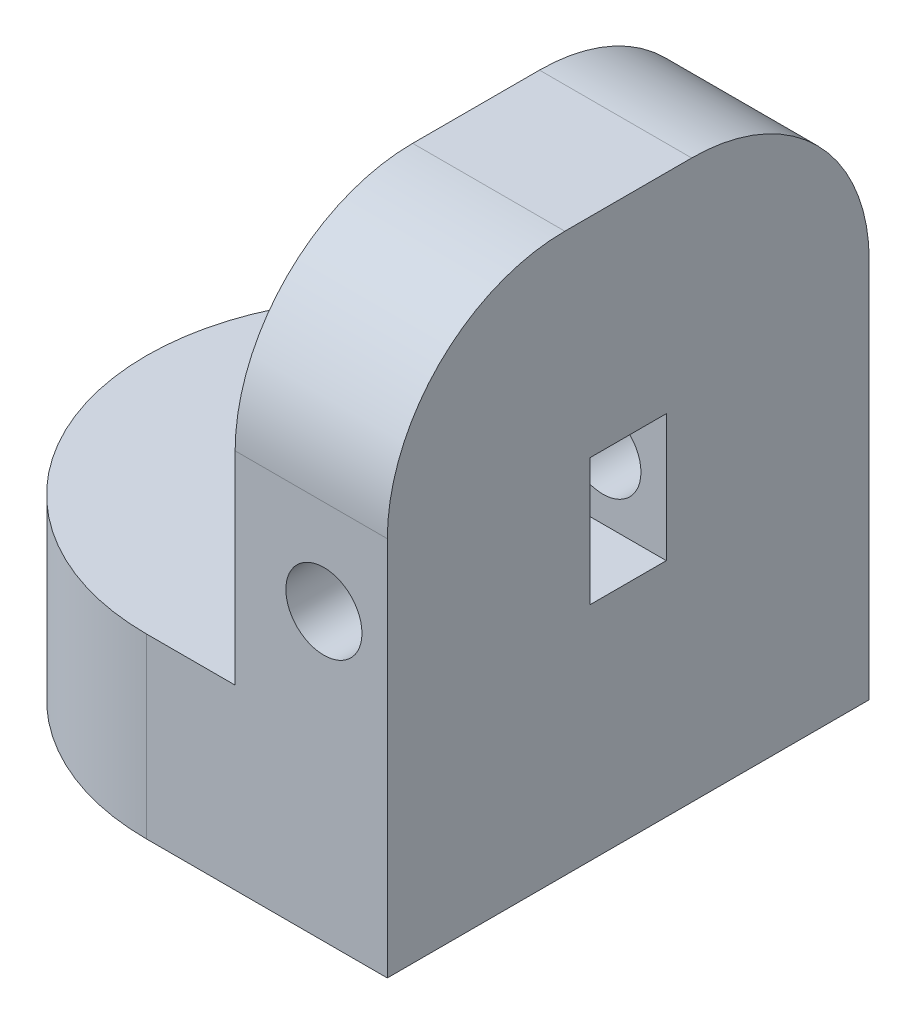
ISO-10303-21;
HEADER;
FILE_DESCRIPTION(('STEP AP214'),'2;1');
FILE_NAME('part.step','',(''),(''),'','','');
FILE_SCHEMA(('AUTOMOTIVE_DESIGN { 1 0 10303 214 1 1 1 1 }'));
ENDSEC;
DATA;
#1=APPLICATION_CONTEXT('core data for automotive mechanical design processes');
#2=APPLICATION_PROTOCOL_DEFINITION('international standard','automotive_design',2000,#1);
#3=PRODUCT_CONTEXT('',#1,'mechanical');
#4=PRODUCT('Part','Part','',(#3));
#5=PRODUCT_RELATED_PRODUCT_CATEGORY('part','',(#4));
#6=PRODUCT_DEFINITION_FORMATION('','',#4);
#7=PRODUCT_DEFINITION_CONTEXT('part definition',#1,'design');
#8=PRODUCT_DEFINITION('design','',#6,#7);
#9=PRODUCT_DEFINITION_SHAPE('','',#8);
#10=(LENGTH_UNIT() NAMED_UNIT(*) SI_UNIT(.MILLI.,.METRE.));
#11=(NAMED_UNIT(*) PLANE_ANGLE_UNIT() SI_UNIT($,.RADIAN.));
#12=(NAMED_UNIT(*) SI_UNIT($,.STERADIAN.) SOLID_ANGLE_UNIT());
#13=UNCERTAINTY_MEASURE_WITH_UNIT(LENGTH_MEASURE(1.E-05),#10,'distance_accuracy_value','');
#14=(GEOMETRIC_REPRESENTATION_CONTEXT(3) GLOBAL_UNCERTAINTY_ASSIGNED_CONTEXT((#13)) GLOBAL_UNIT_ASSIGNED_CONTEXT((#10,
#11,#12)) REPRESENTATION_CONTEXT('',''));
#15=CARTESIAN_POINT('',(0.,0.,0.));
#16=DIRECTION('',(0.,0.,1.));
#17=DIRECTION('',(1.,0.,0.));
#18=AXIS2_PLACEMENT_3D('',#15,#16,#17);
#19=CARTESIAN_POINT('',(9.5,7.,-9.5));
#20=DIRECTION('',(-1.,0.,0.));
#21=DIRECTION('',(0.,0.,1.));
#22=AXIS2_PLACEMENT_3D('',#19,#20,#21);
#23=PLANE('',#22);
#24=DIRECTION('',(0.,0.,-1.));
#25=VECTOR('',#24,1.);
#26=CARTESIAN_POINT('',(9.5,8.75,1.5));
#27=LINE('',#26,#25);
#28=CARTESIAN_POINT('',(9.5,8.75,1.5));
#29=VERTEX_POINT('',#28);
#30=CARTESIAN_POINT('',(9.5,8.75,-1.49999999999999));
#31=VERTEX_POINT('',#30);
#32=EDGE_CURVE('E145',#29,#31,#27,.T.);
#33=ORIENTED_EDGE('',*,*,#32,.F.);
#34=DIRECTION('',(0.,-1.,0.));
#35=VECTOR('',#34,1.);
#36=CARTESIAN_POINT('',(9.5,13.77,1.5));
#37=LINE('',#36,#35);
#38=CARTESIAN_POINT('',(9.5,13.77,1.5));
#39=VERTEX_POINT('',#38);
#40=EDGE_CURVE('E53',#39,#29,#37,.T.);
#41=ORIENTED_EDGE('',*,*,#40,.F.);
#42=DIRECTION('',(0.,0.,1.));
#43=VECTOR('',#42,1.);
#44=CARTESIAN_POINT('',(9.5,13.77,-1.49999999999999));
#45=LINE('',#44,#43);
#46=CARTESIAN_POINT('',(9.5,13.77,-1.49999999999999));
#47=VERTEX_POINT('',#46);
#48=EDGE_CURVE('E151',#47,#39,#45,.T.);
#49=ORIENTED_EDGE('',*,*,#48,.F.);
#50=DIRECTION('',(0.,1.,0.));
#51=VECTOR('',#50,1.);
#52=CARTESIAN_POINT('',(9.5,13.77,-1.49999999999999));
#53=LINE('',#52,#51);
#54=EDGE_CURVE('E136',#31,#47,#53,.T.);
#55=ORIENTED_EDGE('',*,*,#54,.F.);
#56=EDGE_LOOP('',(#33,#41,#49,#55));
#57=FACE_BOUND('',#56,.T.);
#58=DIRECTION('',(0.,-1.,0.));
#59=VECTOR('',#58,1.);
#60=CARTESIAN_POINT('',(9.5,7.,-9.5));
#61=LINE('',#60,#59);
#62=CARTESIAN_POINT('',(9.5,15.,-9.5));
#63=VERTEX_POINT('',#62);
#64=CARTESIAN_POINT('',(9.5,0.,-9.5));
#65=VERTEX_POINT('',#64);
#66=EDGE_CURVE('E190',#63,#65,#61,.T.);
#67=ORIENTED_EDGE('',*,*,#66,.F.);
#68=CARTESIAN_POINT('',(9.5,15.,-2.5));
#69=DIRECTION('',(-1.,0.,0.));
#70=DIRECTION('',(0.,0.,1.));
#71=AXIS2_PLACEMENT_3D('',#68,#69,#70);
#72=CIRCLE('',#71,7.);
#73=CARTESIAN_POINT('',(9.5,22.,-2.5));
#74=VERTEX_POINT('',#73);
#75=EDGE_CURVE('E221',#63,#74,#72,.F.);
#76=ORIENTED_EDGE('',*,*,#75,.T.);
#77=DIRECTION('',(0.,0.,-1.));
#78=VECTOR('',#77,1.);
#79=CARTESIAN_POINT('',(9.5,22.,-9.5));
#80=LINE('',#79,#78);
#81=CARTESIAN_POINT('',(9.5,22.,2.5));
#82=VERTEX_POINT('',#81);
#83=EDGE_CURVE('E161',#82,#74,#80,.T.);
#84=ORIENTED_EDGE('',*,*,#83,.F.);
#85=CARTESIAN_POINT('',(9.5,15.,2.5));
#86=DIRECTION('',(-1.,0.,0.));
#87=DIRECTION('',(0.,0.,1.));
#88=AXIS2_PLACEMENT_3D('',#85,#86,#87);
#89=CIRCLE('',#88,7.);
#90=CARTESIAN_POINT('',(9.5,15.,9.5));
#91=VERTEX_POINT('',#90);
#92=EDGE_CURVE('E219',#82,#91,#89,.F.);
#93=ORIENTED_EDGE('',*,*,#92,.T.);
#94=DIRECTION('',(0.,-1.,0.));
#95=VECTOR('',#94,1.);
#96=CARTESIAN_POINT('',(9.5,7.,9.5));
#97=LINE('',#96,#95);
#98=CARTESIAN_POINT('',(9.5,0.,9.5));
#99=VERTEX_POINT('',#98);
#100=EDGE_CURVE('E180',#91,#99,#97,.T.);
#101=ORIENTED_EDGE('',*,*,#100,.T.);
#102=DIRECTION('',(0.,0.,-1.));
#103=VECTOR('',#102,1.);
#104=CARTESIAN_POINT('',(9.5,0.,-9.5));
#105=LINE('',#104,#103);
#106=EDGE_CURVE('E181',#99,#65,#105,.T.);
#107=ORIENTED_EDGE('',*,*,#106,.T.);
#108=EDGE_LOOP('',(#67,#76,#84,#93,#101,#107));
#109=FACE_BOUND('',#108,.T.);
#110=ADVANCED_FACE('F37',(#57,#109),#23,.F.);
#111=CARTESIAN_POINT('',(-9.5,7.,-9.5));
#112=DIRECTION('',(0.,0.,1.));
#113=DIRECTION('',(1.,0.,0.));
#114=AXIS2_PLACEMENT_3D('',#111,#112,#113);
#115=PLANE('',#114);
#116=CARTESIAN_POINT('',(7.,11.27,-9.5));
#117=DIRECTION('',(0.,0.,1.));
#118=DIRECTION('',(1.,0.,0.));
#119=AXIS2_PLACEMENT_3D('',#116,#117,#118);
#120=CIRCLE('',#119,1.5);
#121=CARTESIAN_POINT('',(8.5,11.27,-9.5));
#122=VERTEX_POINT('',#121);
#123=EDGE_CURVE('E323',#122,#122,#120,.T.);
#124=ORIENTED_EDGE('',*,*,#123,.T.);
#125=EDGE_LOOP('',(#124));
#126=FACE_BOUND('',#125,.T.);
#127=DIRECTION('',(0.,-1.,0.));
#128=VECTOR('',#127,1.);
#129=CARTESIAN_POINT('',(3.5,22.,-9.5));
#130=LINE('',#129,#128);
#131=CARTESIAN_POINT('',(3.5,15.,-9.5));
#132=VERTEX_POINT('',#131);
#133=CARTESIAN_POINT('',(3.5,7.,-9.5));
#134=VERTEX_POINT('',#133);
#135=EDGE_CURVE('E171',#132,#134,#130,.T.);
#136=ORIENTED_EDGE('',*,*,#135,.F.);
#137=DIRECTION('',(-1.,0.,0.));
#138=VECTOR('',#137,1.);
#139=CARTESIAN_POINT('',(-9.5,15.,-9.5));
#140=LINE('',#139,#138);
#141=EDGE_CURVE('E217',#132,#63,#140,.F.);
#142=ORIENTED_EDGE('',*,*,#141,.T.);
#143=ORIENTED_EDGE('',*,*,#66,.T.);
#144=DIRECTION('',(-1.,0.,0.));
#145=VECTOR('',#144,1.);
#146=CARTESIAN_POINT('',(-9.5,0.,-9.5));
#147=LINE('',#146,#145);
#148=CARTESIAN_POINT('',(0.,0.,-9.5));
#149=VERTEX_POINT('',#148);
#150=EDGE_CURVE('E184',#65,#149,#147,.T.);
#151=ORIENTED_EDGE('',*,*,#150,.T.);
#152=DIRECTION('',(0.,-1.,0.));
#153=VECTOR('',#152,1.);
#154=CARTESIAN_POINT('',(0.,7.,-9.5));
#155=LINE('',#154,#153);
#156=CARTESIAN_POINT('',(0.,7.,-9.5));
#157=VERTEX_POINT('',#156);
#158=EDGE_CURVE('E196',#149,#157,#155,.F.);
#159=ORIENTED_EDGE('',*,*,#158,.T.);
#160=DIRECTION('',(-1.,0.,0.));
#161=VECTOR('',#160,1.);
#162=CARTESIAN_POINT('',(-9.5,7.,-9.5));
#163=LINE('',#162,#161);
#164=EDGE_CURVE('E174',#134,#157,#163,.T.);
#165=ORIENTED_EDGE('',*,*,#164,.F.);
#166=EDGE_LOOP('',(#136,#142,#143,#151,#159,#165));
#167=FACE_BOUND('',#166,.T.);
#168=ADVANCED_FACE('F250',(#126,#167),#115,.F.);
#169=CARTESIAN_POINT('',(-9.5,7.,9.5));
#170=DIRECTION('',(0.,0.,-1.));
#171=DIRECTION('',(-1.,0.,0.));
#172=AXIS2_PLACEMENT_3D('',#169,#170,#171);
#173=PLANE('',#172);
#174=CARTESIAN_POINT('',(7.,11.27,9.5));
#175=DIRECTION('',(0.,0.,1.));
#176=DIRECTION('',(1.,0.,0.));
#177=AXIS2_PLACEMENT_3D('',#174,#175,#176);
#178=CIRCLE('',#177,1.5);
#179=CARTESIAN_POINT('',(8.5,11.27,9.5));
#180=VERTEX_POINT('',#179);
#181=EDGE_CURVE('E321',#180,#180,#178,.T.);
#182=ORIENTED_EDGE('',*,*,#181,.F.);
#183=EDGE_LOOP('',(#182));
#184=FACE_BOUND('',#183,.T.);
#185=ORIENTED_EDGE('',*,*,#100,.F.);
#186=DIRECTION('',(1.,0.,0.));
#187=VECTOR('',#186,1.);
#188=CARTESIAN_POINT('',(-9.5,15.,9.5));
#189=LINE('',#188,#187);
#190=CARTESIAN_POINT('',(3.5,15.,9.5));
#191=VERTEX_POINT('',#190);
#192=EDGE_CURVE('E223',#91,#191,#189,.F.);
#193=ORIENTED_EDGE('',*,*,#192,.T.);
#194=DIRECTION('',(0.,-1.,0.));
#195=VECTOR('',#194,1.);
#196=CARTESIAN_POINT('',(3.5,22.,9.5));
#197=LINE('',#196,#195);
#198=CARTESIAN_POINT('',(3.5,7.,9.5));
#199=VERTEX_POINT('',#198);
#200=EDGE_CURVE('E167',#191,#199,#197,.T.);
#201=ORIENTED_EDGE('',*,*,#200,.T.);
#202=DIRECTION('',(1.,0.,0.));
#203=VECTOR('',#202,1.);
#204=CARTESIAN_POINT('',(-9.5,7.,9.5));
#205=LINE('',#204,#203);
#206=CARTESIAN_POINT('',(0.,7.,9.5));
#207=VERTEX_POINT('',#206);
#208=EDGE_CURVE('E176',#207,#199,#205,.T.);
#209=ORIENTED_EDGE('',*,*,#208,.F.);
#210=DIRECTION('',(0.,-1.,0.));
#211=VECTOR('',#210,1.);
#212=CARTESIAN_POINT('',(0.,7.,9.5));
#213=LINE('',#212,#211);
#214=CARTESIAN_POINT('',(0.,0.,9.5));
#215=VERTEX_POINT('',#214);
#216=EDGE_CURVE('E203',#207,#215,#213,.T.);
#217=ORIENTED_EDGE('',*,*,#216,.T.);
#218=DIRECTION('',(1.,0.,0.));
#219=VECTOR('',#218,1.);
#220=CARTESIAN_POINT('',(-9.5,0.,9.5));
#221=LINE('',#220,#219);
#222=EDGE_CURVE('E177',#215,#99,#221,.T.);
#223=ORIENTED_EDGE('',*,*,#222,.T.);
#224=EDGE_LOOP('',(#185,#193,#201,#209,#217,#223));
#225=FACE_BOUND('',#224,.T.);
#226=ADVANCED_FACE('F255',(#184,#225),#173,.F.);
#227=CARTESIAN_POINT('',(0.,7.,0.));
#228=DIRECTION('',(0.,1.,0.));
#229=DIRECTION('',(0.,0.,1.));
#230=AXIS2_PLACEMENT_3D('',#227,#228,#229);
#231=PLANE('',#230);
#232=CARTESIAN_POINT('',(-2.,7.,0.));
#233=DIRECTION('',(0.,1.,0.));
#234=DIRECTION('',(0.,0.,1.));
#235=AXIS2_PLACEMENT_3D('',#232,#233,#234);
#236=CIRCLE('',#235,2.);
#237=CARTESIAN_POINT('',(-2.,7.,2.));
#238=VERTEX_POINT('',#237);
#239=EDGE_CURVE('E329',#238,#238,#236,.T.);
#240=ORIENTED_EDGE('',*,*,#239,.F.);
#241=EDGE_LOOP('',(#240));
#242=FACE_BOUND('',#241,.T.);
#243=DIRECTION('',(0.,0.,1.));
#244=VECTOR('',#243,1.);
#245=CARTESIAN_POINT('',(3.5,7.,-9.5));
#246=LINE('',#245,#244);
#247=EDGE_CURVE('E158',#134,#199,#246,.T.);
#248=ORIENTED_EDGE('',*,*,#247,.F.);
#249=ORIENTED_EDGE('',*,*,#164,.T.);
#250=CARTESIAN_POINT('',(0.,7.,0.));
#251=DIRECTION('',(0.,1.,0.));
#252=DIRECTION('',(0.,0.,1.));
#253=AXIS2_PLACEMENT_3D('',#250,#251,#252);
#254=CIRCLE('',#253,9.5);
#255=CARTESIAN_POINT('',(-9.5,7.,0.));
#256=VERTEX_POINT('',#255);
#257=EDGE_CURVE('E201',#157,#256,#254,.T.);
#258=ORIENTED_EDGE('',*,*,#257,.T.);
#259=CARTESIAN_POINT('',(0.,7.,0.));
#260=DIRECTION('',(0.,1.,0.));
#261=DIRECTION('',(0.,0.,1.));
#262=AXIS2_PLACEMENT_3D('',#259,#260,#261);
#263=CIRCLE('',#262,9.5);
#264=EDGE_CURVE('E199',#256,#207,#263,.T.);
#265=ORIENTED_EDGE('',*,*,#264,.T.);
#266=ORIENTED_EDGE('',*,*,#208,.T.);
#267=EDGE_LOOP('',(#248,#249,#258,#265,#266));
#268=FACE_BOUND('',#267,.T.);
#269=ADVANCED_FACE('F304',(#242,#268),#231,.T.);
#270=CARTESIAN_POINT('',(0.,0.,0.));
#271=DIRECTION('',(0.,1.,0.));
#272=DIRECTION('',(0.,0.,1.));
#273=AXIS2_PLACEMENT_3D('',#270,#271,#272);
#274=PLANE('',#273);
#275=CARTESIAN_POINT('',(-2.,0.,0.));
#276=DIRECTION('',(0.,1.,0.));
#277=DIRECTION('',(0.,0.,1.));
#278=AXIS2_PLACEMENT_3D('',#275,#276,#277);
#279=CIRCLE('',#278,2.);
#280=CARTESIAN_POINT('',(-2.,0.,2.));
#281=VERTEX_POINT('',#280);
#282=EDGE_CURVE('E324',#281,#281,#279,.T.);
#283=ORIENTED_EDGE('',*,*,#282,.T.);
#284=EDGE_LOOP('',(#283));
#285=FACE_BOUND('',#284,.T.);
#286=CARTESIAN_POINT('',(0.,0.,0.));
#287=DIRECTION('',(0.,1.,0.));
#288=DIRECTION('',(0.,0.,1.));
#289=AXIS2_PLACEMENT_3D('',#286,#287,#288);
#290=CIRCLE('',#289,9.5);
#291=CARTESIAN_POINT('',(-9.5,0.,0.));
#292=VERTEX_POINT('',#291);
#293=EDGE_CURVE('E192',#215,#292,#290,.F.);
#294=ORIENTED_EDGE('',*,*,#293,.T.);
#295=CARTESIAN_POINT('',(0.,0.,0.));
#296=DIRECTION('',(0.,1.,0.));
#297=DIRECTION('',(0.,0.,1.));
#298=AXIS2_PLACEMENT_3D('',#295,#296,#297);
#299=CIRCLE('',#298,9.5);
#300=EDGE_CURVE('E194',#292,#149,#299,.F.);
#301=ORIENTED_EDGE('',*,*,#300,.T.);
#302=ORIENTED_EDGE('',*,*,#150,.F.);
#303=ORIENTED_EDGE('',*,*,#106,.F.);
#304=ORIENTED_EDGE('',*,*,#222,.F.);
#305=EDGE_LOOP('',(#294,#301,#302,#303,#304));
#306=FACE_BOUND('',#305,.T.);
#307=ADVANCED_FACE('F266',(#285,#306),#274,.F.);
#308=CARTESIAN_POINT('',(0.,7.,0.));
#309=DIRECTION('',(0.,-1.,0.));
#310=DIRECTION('',(0.,0.,-1.));
#311=AXIS2_PLACEMENT_3D('',#308,#309,#310);
#312=CYLINDRICAL_SURFACE('',#311,9.5);
#313=ORIENTED_EDGE('',*,*,#216,.F.);
#314=ORIENTED_EDGE('',*,*,#264,.F.);
#315=DIRECTION('',(0.,-1.,0.));
#316=VECTOR('',#315,1.);
#317=CARTESIAN_POINT('',(-9.5,7.,0.));
#318=LINE('',#317,#316);
#319=EDGE_CURVE('E173',#292,#256,#318,.F.);
#320=ORIENTED_EDGE('',*,*,#319,.F.);
#321=ORIENTED_EDGE('',*,*,#293,.F.);
#322=EDGE_LOOP('',(#313,#314,#320,#321));
#323=FACE_BOUND('',#322,.T.);
#324=ADVANCED_FACE('F263',(#323),#312,.T.);
#325=CARTESIAN_POINT('',(0.,7.,0.));
#326=DIRECTION('',(0.,-1.,0.));
#327=DIRECTION('',(0.,0.,-1.));
#328=AXIS2_PLACEMENT_3D('',#325,#326,#327);
#329=CYLINDRICAL_SURFACE('',#328,9.5);
#330=ORIENTED_EDGE('',*,*,#257,.F.);
#331=ORIENTED_EDGE('',*,*,#158,.F.);
#332=ORIENTED_EDGE('',*,*,#300,.F.);
#333=ORIENTED_EDGE('',*,*,#319,.T.);
#334=EDGE_LOOP('',(#330,#331,#332,#333));
#335=FACE_BOUND('',#334,.T.);
#336=ADVANCED_FACE('F260',(#335),#329,.T.);
#337=CARTESIAN_POINT('',(3.5,22.,-9.5));
#338=DIRECTION('',(1.,0.,0.));
#339=DIRECTION('',(0.,0.,-1.));
#340=AXIS2_PLACEMENT_3D('',#337,#338,#339);
#341=PLANE('',#340);
#342=DIRECTION('',(0.,0.,1.));
#343=VECTOR('',#342,1.);
#344=CARTESIAN_POINT('',(3.5,13.77,-9.5));
#345=LINE('',#344,#343);
#346=CARTESIAN_POINT('',(3.5,13.77,-1.49999999999999));
#347=VERTEX_POINT('',#346);
#348=CARTESIAN_POINT('',(3.5,13.77,1.5));
#349=VERTEX_POINT('',#348);
#350=EDGE_CURVE('E46',#347,#349,#345,.T.);
#351=ORIENTED_EDGE('',*,*,#350,.T.);
#352=DIRECTION('',(0.,-1.,0.));
#353=VECTOR('',#352,1.);
#354=CARTESIAN_POINT('',(3.5,22.,1.5));
#355=LINE('',#354,#353);
#356=CARTESIAN_POINT('',(3.5,8.75,1.5));
#357=VERTEX_POINT('',#356);
#358=EDGE_CURVE('E11',#349,#357,#355,.T.);
#359=ORIENTED_EDGE('',*,*,#358,.T.);
#360=DIRECTION('',(0.,0.,-1.));
#361=VECTOR('',#360,1.);
#362=CARTESIAN_POINT('',(3.5,8.75,-9.5));
#363=LINE('',#362,#361);
#364=CARTESIAN_POINT('',(3.5,8.75,-1.49999999999999));
#365=VERTEX_POINT('',#364);
#366=EDGE_CURVE('E225',#357,#365,#363,.T.);
#367=ORIENTED_EDGE('',*,*,#366,.T.);
#368=DIRECTION('',(0.,1.,0.));
#369=VECTOR('',#368,1.);
#370=CARTESIAN_POINT('',(3.5,22.,-1.49999999999999));
#371=LINE('',#370,#369);
#372=EDGE_CURVE('E139',#365,#347,#371,.T.);
#373=ORIENTED_EDGE('',*,*,#372,.T.);
#374=EDGE_LOOP('',(#351,#359,#367,#373));
#375=FACE_BOUND('',#374,.T.);
#376=DIRECTION('',(0.,0.,1.));
#377=VECTOR('',#376,1.);
#378=CARTESIAN_POINT('',(3.5,22.,-9.5));
#379=LINE('',#378,#377);
#380=CARTESIAN_POINT('',(3.5,22.,-2.5));
#381=VERTEX_POINT('',#380);
#382=CARTESIAN_POINT('',(3.5,22.,2.5));
#383=VERTEX_POINT('',#382);
#384=EDGE_CURVE('E164',#381,#383,#379,.T.);
#385=ORIENTED_EDGE('',*,*,#384,.F.);
#386=CARTESIAN_POINT('',(3.5,15.,-2.5));
#387=DIRECTION('',(1.,0.,0.));
#388=DIRECTION('',(0.,0.,-1.));
#389=AXIS2_PLACEMENT_3D('',#386,#387,#388);
#390=CIRCLE('',#389,7.);
#391=EDGE_CURVE('E215',#381,#132,#390,.F.);
#392=ORIENTED_EDGE('',*,*,#391,.T.);
#393=ORIENTED_EDGE('',*,*,#135,.T.);
#394=ORIENTED_EDGE('',*,*,#247,.T.);
#395=ORIENTED_EDGE('',*,*,#200,.F.);
#396=CARTESIAN_POINT('',(3.5,15.,2.5));
#397=DIRECTION('',(1.,0.,0.));
#398=DIRECTION('',(0.,0.,-1.));
#399=AXIS2_PLACEMENT_3D('',#396,#397,#398);
#400=CIRCLE('',#399,7.);
#401=EDGE_CURVE('E213',#191,#383,#400,.F.);
#402=ORIENTED_EDGE('',*,*,#401,.T.);
#403=EDGE_LOOP('',(#385,#392,#393,#394,#395,#402));
#404=FACE_BOUND('',#403,.T.);
#405=ADVANCED_FACE('F230',(#375,#404),#341,.F.);
#406=CARTESIAN_POINT('',(0.,22.,0.));
#407=DIRECTION('',(0.,-1.,0.));
#408=DIRECTION('',(0.,0.,-1.));
#409=AXIS2_PLACEMENT_3D('',#406,#407,#408);
#410=PLANE('',#409);
#411=ORIENTED_EDGE('',*,*,#83,.T.);
#412=DIRECTION('',(-1.,0.,0.));
#413=VECTOR('',#412,1.);
#414=CARTESIAN_POINT('',(0.,22.,-2.5));
#415=LINE('',#414,#413);
#416=EDGE_CURVE('E210',#74,#381,#415,.T.);
#417=ORIENTED_EDGE('',*,*,#416,.T.);
#418=ORIENTED_EDGE('',*,*,#384,.T.);
#419=DIRECTION('',(1.,0.,0.));
#420=VECTOR('',#419,1.);
#421=CARTESIAN_POINT('',(0.,22.,2.5));
#422=LINE('',#421,#420);
#423=EDGE_CURVE('E205',#383,#82,#422,.T.);
#424=ORIENTED_EDGE('',*,*,#423,.T.);
#425=EDGE_LOOP('',(#411,#417,#418,#424));
#426=FACE_BOUND('',#425,.T.);
#427=ADVANCED_FACE('F269',(#426),#410,.F.);
#428=CARTESIAN_POINT('',(0.,15.,-2.5));
#429=DIRECTION('',(-1.,0.,0.));
#430=DIRECTION('',(0.,0.,1.));
#431=AXIS2_PLACEMENT_3D('',#428,#429,#430);
#432=CYLINDRICAL_SURFACE('',#431,7.);
#433=ORIENTED_EDGE('',*,*,#75,.F.);
#434=ORIENTED_EDGE('',*,*,#141,.F.);
#435=ORIENTED_EDGE('',*,*,#391,.F.);
#436=ORIENTED_EDGE('',*,*,#416,.F.);
#437=EDGE_LOOP('',(#433,#434,#435,#436));
#438=FACE_BOUND('',#437,.T.);
#439=ADVANCED_FACE('F244',(#438),#432,.T.);
#440=CARTESIAN_POINT('',(0.,15.,2.5));
#441=DIRECTION('',(1.,0.,0.));
#442=DIRECTION('',(0.,0.,-1.));
#443=AXIS2_PLACEMENT_3D('',#440,#441,#442);
#444=CYLINDRICAL_SURFACE('',#443,7.);
#445=ORIENTED_EDGE('',*,*,#401,.F.);
#446=ORIENTED_EDGE('',*,*,#192,.F.);
#447=ORIENTED_EDGE('',*,*,#92,.F.);
#448=ORIENTED_EDGE('',*,*,#423,.F.);
#449=EDGE_LOOP('',(#445,#446,#447,#448));
#450=FACE_BOUND('',#449,.T.);
#451=ADVANCED_FACE('F39',(#450),#444,.T.);
#452=CARTESIAN_POINT('',(-9.5,13.77,1.5));
#453=DIRECTION('',(0.,0.,1.));
#454=DIRECTION('',(0.,-1.,0.));
#455=AXIS2_PLACEMENT_3D('',#452,#453,#454);
#456=PLANE('',#455);
#457=CARTESIAN_POINT('',(7.,11.27,1.5));
#458=DIRECTION('',(0.,0.,1.));
#459=DIRECTION('',(0.,-1.,0.));
#460=AXIS2_PLACEMENT_3D('',#457,#458,#459);
#461=CIRCLE('',#460,1.5);
#462=CARTESIAN_POINT('',(7.,9.77,1.5));
#463=VERTEX_POINT('',#462);
#464=EDGE_CURVE('E333',#463,#463,#461,.T.);
#465=ORIENTED_EDGE('',*,*,#464,.T.);
#466=EDGE_LOOP('',(#465));
#467=FACE_BOUND('',#466,.T.);
#468=DIRECTION('',(1.,0.,0.));
#469=VECTOR('',#468,1.);
#470=CARTESIAN_POINT('',(-9.5,13.77,1.5));
#471=LINE('',#470,#469);
#472=EDGE_CURVE('E156',#349,#39,#471,.T.);
#473=ORIENTED_EDGE('',*,*,#472,.T.);
#474=ORIENTED_EDGE('',*,*,#40,.T.);
#475=DIRECTION('',(1.,0.,0.));
#476=VECTOR('',#475,1.);
#477=CARTESIAN_POINT('',(-9.5,8.75,1.5));
#478=LINE('',#477,#476);
#479=EDGE_CURVE('E142',#357,#29,#478,.T.);
#480=ORIENTED_EDGE('',*,*,#479,.F.);
#481=ORIENTED_EDGE('',*,*,#358,.F.);
#482=EDGE_LOOP('',(#473,#474,#480,#481));
#483=FACE_BOUND('',#482,.T.);
#484=ADVANCED_FACE('F235',(#467,#483),#456,.F.);
#485=CARTESIAN_POINT('',(-9.5,13.77,-1.49999999999999));
#486=DIRECTION('',(0.,1.,0.));
#487=DIRECTION('',(0.,0.,1.));
#488=AXIS2_PLACEMENT_3D('',#485,#486,#487);
#489=PLANE('',#488);
#490=DIRECTION('',(1.,0.,0.));
#491=VECTOR('',#490,1.);
#492=CARTESIAN_POINT('',(-9.5,13.77,-1.49999999999999));
#493=LINE('',#492,#491);
#494=EDGE_CURVE('E141',#347,#47,#493,.T.);
#495=ORIENTED_EDGE('',*,*,#494,.T.);
#496=ORIENTED_EDGE('',*,*,#48,.T.);
#497=ORIENTED_EDGE('',*,*,#472,.F.);
#498=ORIENTED_EDGE('',*,*,#350,.F.);
#499=EDGE_LOOP('',(#495,#496,#497,#498));
#500=FACE_BOUND('',#499,.T.);
#501=ADVANCED_FACE('F234',(#500),#489,.F.);
#502=CARTESIAN_POINT('',(-9.5,13.77,-1.49999999999999));
#503=DIRECTION('',(0.,0.,-1.));
#504=DIRECTION('',(0.,1.,0.));
#505=AXIS2_PLACEMENT_3D('',#502,#503,#504);
#506=PLANE('',#505);
#507=CARTESIAN_POINT('',(7.,11.27,-1.49999999999999));
#508=DIRECTION('',(0.,0.,-1.));
#509=DIRECTION('',(0.,1.,0.));
#510=AXIS2_PLACEMENT_3D('',#507,#508,#509);
#511=CIRCLE('',#510,1.5);
#512=CARTESIAN_POINT('',(7.,12.77,-1.49999999999999));
#513=VERTEX_POINT('',#512);
#514=EDGE_CURVE('E41',#513,#513,#511,.T.);
#515=ORIENTED_EDGE('',*,*,#514,.T.);
#516=EDGE_LOOP('',(#515));
#517=FACE_BOUND('',#516,.T.);
#518=DIRECTION('',(1.,0.,0.));
#519=VECTOR('',#518,1.);
#520=CARTESIAN_POINT('',(-9.5,8.75,-1.49999999999999));
#521=LINE('',#520,#519);
#522=EDGE_CURVE('E61',#365,#31,#521,.T.);
#523=ORIENTED_EDGE('',*,*,#522,.T.);
#524=ORIENTED_EDGE('',*,*,#54,.T.);
#525=ORIENTED_EDGE('',*,*,#494,.F.);
#526=ORIENTED_EDGE('',*,*,#372,.F.);
#527=EDGE_LOOP('',(#523,#524,#525,#526));
#528=FACE_BOUND('',#527,.T.);
#529=ADVANCED_FACE('F133',(#517,#528),#506,.F.);
#530=CARTESIAN_POINT('',(-9.5,8.75,1.5));
#531=DIRECTION('',(0.,-1.,0.));
#532=DIRECTION('',(0.,0.,-1.));
#533=AXIS2_PLACEMENT_3D('',#530,#531,#532);
#534=PLANE('',#533);
#535=ORIENTED_EDGE('',*,*,#479,.T.);
#536=ORIENTED_EDGE('',*,*,#32,.T.);
#537=ORIENTED_EDGE('',*,*,#522,.F.);
#538=ORIENTED_EDGE('',*,*,#366,.F.);
#539=EDGE_LOOP('',(#535,#536,#537,#538));
#540=FACE_BOUND('',#539,.T.);
#541=ADVANCED_FACE('F146',(#540),#534,.F.);
#542=CARTESIAN_POINT('',(7.,11.27,-9.5));
#543=DIRECTION('',(0.,0.,1.));
#544=DIRECTION('',(1.,0.,0.));
#545=AXIS2_PLACEMENT_3D('',#542,#543,#544);
#546=CYLINDRICAL_SURFACE('',#545,1.5);
#547=ORIENTED_EDGE('',*,*,#123,.F.);
#548=EDGE_LOOP('',(#547));
#549=FACE_BOUND('',#548,.T.);
#550=ORIENTED_EDGE('',*,*,#514,.F.);
#551=EDGE_LOOP('',(#550));
#552=FACE_BOUND('',#551,.T.);
#553=ADVANCED_FACE('F339',(#549,#552),#546,.F.);
#554=ORIENTED_EDGE('',*,*,#181,.T.);
#555=EDGE_LOOP('',(#554));
#556=FACE_BOUND('',#555,.T.);
#557=ORIENTED_EDGE('',*,*,#464,.F.);
#558=EDGE_LOOP('',(#557));
#559=FACE_BOUND('',#558,.T.);
#560=ADVANCED_FACE('F341',(#556,#559),#546,.F.);
#561=CARTESIAN_POINT('',(-2.,0.,0.));
#562=DIRECTION('',(0.,1.,0.));
#563=DIRECTION('',(0.,0.,1.));
#564=AXIS2_PLACEMENT_3D('',#561,#562,#563);
#565=CYLINDRICAL_SURFACE('',#564,2.);
#566=ORIENTED_EDGE('',*,*,#282,.F.);
#567=EDGE_LOOP('',(#566));
#568=FACE_BOUND('',#567,.T.);
#569=ORIENTED_EDGE('',*,*,#239,.T.);
#570=EDGE_LOOP('',(#569));
#571=FACE_BOUND('',#570,.T.);
#572=ADVANCED_FACE('F348',(#568,#571),#565,.F.);
#573=CLOSED_SHELL('',(#110,#168,#226,#269,#307,#324,#336,#405,#427,#439,#451,#484,#501,#529,
#541,#553,#560,#572));
#574=MANIFOLD_SOLID_BREP('B2',#573);
#575=ADVANCED_BREP_SHAPE_REPRESENTATION('',(#18,#574),#14);
#576=SHAPE_DEFINITION_REPRESENTATION(#9,#575);
ENDSEC;
END-ISO-10303-21;
